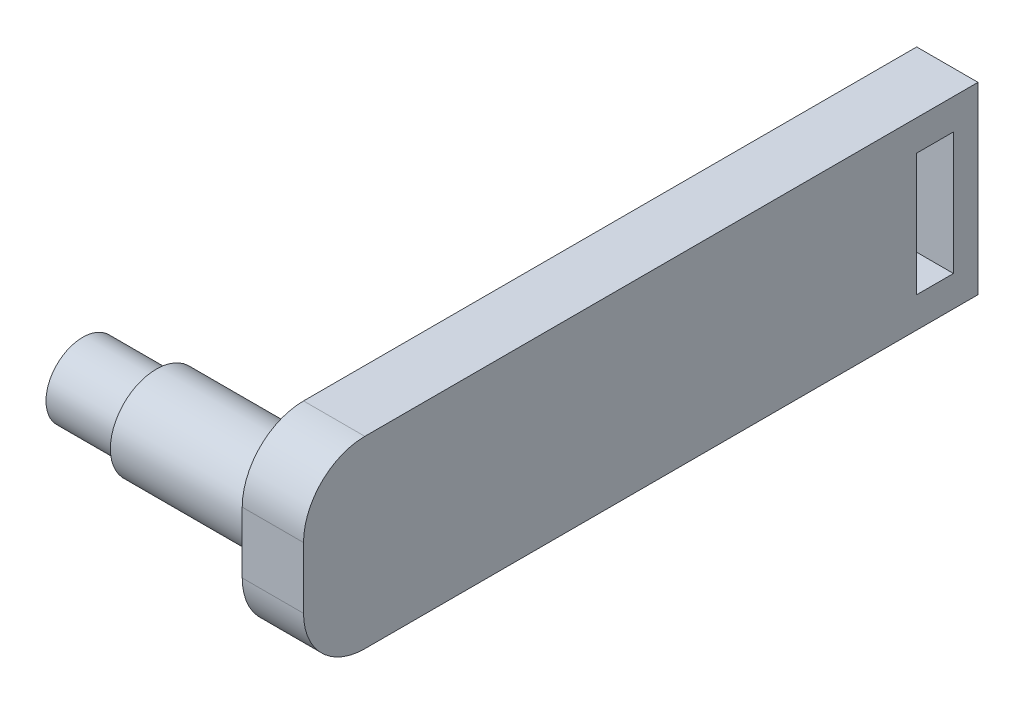
ISO-10303-21;
HEADER;
FILE_DESCRIPTION(('STEP AP214'),'2;1');
FILE_NAME('part.step','',(''),(''),'','','');
FILE_SCHEMA(('AUTOMOTIVE_DESIGN { 1 0 10303 214 1 1 1 1 }'));
ENDSEC;
DATA;
#1=APPLICATION_CONTEXT('core data for automotive mechanical design processes');
#2=APPLICATION_PROTOCOL_DEFINITION('international standard','automotive_design',2000,#1);
#3=PRODUCT_CONTEXT('',#1,'mechanical');
#4=PRODUCT('Part','Part','',(#3));
#5=PRODUCT_RELATED_PRODUCT_CATEGORY('part','',(#4));
#6=PRODUCT_DEFINITION_FORMATION('','',#4);
#7=PRODUCT_DEFINITION_CONTEXT('part definition',#1,'design');
#8=PRODUCT_DEFINITION('design','',#6,#7);
#9=PRODUCT_DEFINITION_SHAPE('','',#8);
#10=(LENGTH_UNIT() NAMED_UNIT(*) SI_UNIT(.MILLI.,.METRE.));
#11=(NAMED_UNIT(*) PLANE_ANGLE_UNIT() SI_UNIT($,.RADIAN.));
#12=(NAMED_UNIT(*) SI_UNIT($,.STERADIAN.) SOLID_ANGLE_UNIT());
#13=UNCERTAINTY_MEASURE_WITH_UNIT(LENGTH_MEASURE(1.E-05),#10,'distance_accuracy_value','');
#14=(GEOMETRIC_REPRESENTATION_CONTEXT(3) GLOBAL_UNCERTAINTY_ASSIGNED_CONTEXT((#13)) GLOBAL_UNIT_ASSIGNED_CONTEXT((#10,
#11,#12)) REPRESENTATION_CONTEXT('',''));
#15=CARTESIAN_POINT('',(0.,0.,0.));
#16=DIRECTION('',(0.,0.,1.));
#17=DIRECTION('',(1.,0.,0.));
#18=AXIS2_PLACEMENT_3D('',#15,#16,#17);
#19=CARTESIAN_POINT('',(0.,15.,26.2097315436242));
#20=DIRECTION('',(0.,0.,-1.));
#21=DIRECTION('',(-1.,0.,0.));
#22=AXIS2_PLACEMENT_3D('',#19,#20,#21);
#23=PLANE('',#22);
#24=DIRECTION('',(0.,-1.,0.));
#25=VECTOR('',#24,1.);
#26=CARTESIAN_POINT('',(-56.8805369127517,15.,26.2097315436242));
#27=LINE('',#26,#25);
#28=CARTESIAN_POINT('',(-56.8805369127517,10.,26.2097315436242));
#29=VERTEX_POINT('',#28);
#30=CARTESIAN_POINT('',(-56.8805369127517,5.,26.2097315436242));
#31=VERTEX_POINT('',#30);
#32=EDGE_CURVE('E169',#29,#31,#27,.T.);
#33=ORIENTED_EDGE('',*,*,#32,.F.);
#34=DIRECTION('',(1.,0.,0.));
#35=VECTOR('',#34,1.);
#36=CARTESIAN_POINT('',(-61.8805369127517,10.,26.2097315436242));
#37=LINE('',#36,#35);
#38=CARTESIAN_POINT('',(-61.8805369127517,10.,26.2097315436242));
#39=VERTEX_POINT('',#38);
#40=EDGE_CURVE('E182',#29,#39,#37,.F.);
#41=ORIENTED_EDGE('',*,*,#40,.T.);
#42=DIRECTION('',(0.,-1.,0.));
#43=VECTOR('',#42,1.);
#44=CARTESIAN_POINT('',(-61.8805369127517,15.,26.2097315436242));
#45=LINE('',#44,#43);
#46=CARTESIAN_POINT('',(-61.8805369127517,5.,26.2097315436242));
#47=VERTEX_POINT('',#46);
#48=EDGE_CURVE('E155',#39,#47,#45,.T.);
#49=ORIENTED_EDGE('',*,*,#48,.T.);
#50=DIRECTION('',(1.,0.,0.));
#51=VECTOR('',#50,1.);
#52=CARTESIAN_POINT('',(0.,5.,26.2097315436242));
#53=LINE('',#52,#51);
#54=EDGE_CURVE('E179',#47,#31,#53,.T.);
#55=ORIENTED_EDGE('',*,*,#54,.T.);
#56=EDGE_LOOP('',(#33,#41,#49,#55));
#57=FACE_BOUND('',#56,.T.);
#58=ADVANCED_FACE('F38',(#57),#23,.F.);
#59=CARTESIAN_POINT('',(-56.8805369127517,15.,0.));
#60=DIRECTION('',(-1.,0.,0.));
#61=DIRECTION('',(0.,0.,1.));
#62=AXIS2_PLACEMENT_3D('',#59,#60,#61);
#63=PLANE('',#62);
#64=DIRECTION('',(0.,0.,1.));
#65=VECTOR('',#64,1.);
#66=CARTESIAN_POINT('',(-56.8805369127517,12.5,-26.7902684563758));
#67=LINE('',#66,#65);
#68=CARTESIAN_POINT('',(-56.8805369127517,12.5,-26.7902684563758));
#69=VERTEX_POINT('',#68);
#70=CARTESIAN_POINT('',(-56.8805369127517,12.5,-23.7902684563758));
#71=VERTEX_POINT('',#70);
#72=EDGE_CURVE('E296',#69,#71,#67,.T.);
#73=ORIENTED_EDGE('',*,*,#72,.F.);
#74=DIRECTION('',(0.,1.,0.));
#75=VECTOR('',#74,1.);
#76=CARTESIAN_POINT('',(-56.8805369127517,2.5,-26.7902684563758));
#77=LINE('',#76,#75);
#78=CARTESIAN_POINT('',(-56.8805369127517,2.5,-26.7902684563758));
#79=VERTEX_POINT('',#78);
#80=EDGE_CURVE('E146',#79,#69,#77,.T.);
#81=ORIENTED_EDGE('',*,*,#80,.F.);
#82=DIRECTION('',(0.,0.,-1.));
#83=VECTOR('',#82,1.);
#84=CARTESIAN_POINT('',(-56.8805369127517,2.5,-26.7902684563758));
#85=LINE('',#84,#83);
#86=CARTESIAN_POINT('',(-56.8805369127517,2.5,-23.7902684563758));
#87=VERTEX_POINT('',#86);
#88=EDGE_CURVE('E143',#87,#79,#85,.T.);
#89=ORIENTED_EDGE('',*,*,#88,.F.);
#90=DIRECTION('',(0.,-1.,0.));
#91=VECTOR('',#90,1.);
#92=CARTESIAN_POINT('',(-56.8805369127517,2.5,-23.7902684563758));
#93=LINE('',#92,#91);
#94=EDGE_CURVE('E121',#71,#87,#93,.T.);
#95=ORIENTED_EDGE('',*,*,#94,.F.);
#96=EDGE_LOOP('',(#73,#81,#89,#95));
#97=FACE_BOUND('',#96,.T.);
#98=DIRECTION('',(0.,0.,-1.));
#99=VECTOR('',#98,1.);
#100=CARTESIAN_POINT('',(-56.8805369127517,15.,0.));
#101=LINE('',#100,#99);
#102=CARTESIAN_POINT('',(-56.8805369127517,15.,21.2097315436242));
#103=VERTEX_POINT('',#102);
#104=CARTESIAN_POINT('',(-56.8805369127517,15.,-28.7902684563758));
#105=VERTEX_POINT('',#104);
#106=EDGE_CURVE('E147',#103,#105,#101,.T.);
#107=ORIENTED_EDGE('',*,*,#106,.F.);
#108=CARTESIAN_POINT('',(-56.8805369127517,10.,21.2097315436242));
#109=DIRECTION('',(-1.,0.,0.));
#110=DIRECTION('',(0.,0.,1.));
#111=AXIS2_PLACEMENT_3D('',#108,#109,#110);
#112=CIRCLE('',#111,5.);
#113=EDGE_CURVE('E177',#103,#29,#112,.F.);
#114=ORIENTED_EDGE('',*,*,#113,.T.);
#115=ORIENTED_EDGE('',*,*,#32,.T.);
#116=CARTESIAN_POINT('',(-56.8805369127517,5.,21.2097315436242));
#117=DIRECTION('',(-1.,0.,0.));
#118=DIRECTION('',(0.,0.,1.));
#119=AXIS2_PLACEMENT_3D('',#116,#117,#118);
#120=CIRCLE('',#119,5.);
#121=CARTESIAN_POINT('',(-56.8805369127517,0.,21.2097315436242));
#122=VERTEX_POINT('',#121);
#123=EDGE_CURVE('E175',#31,#122,#120,.F.);
#124=ORIENTED_EDGE('',*,*,#123,.T.);
#125=DIRECTION('',(0.,0.,-1.));
#126=VECTOR('',#125,1.);
#127=CARTESIAN_POINT('',(-56.8805369127517,0.,0.));
#128=LINE('',#127,#126);
#129=CARTESIAN_POINT('',(-56.8805369127517,0.,-28.7902684563758));
#130=VERTEX_POINT('',#129);
#131=EDGE_CURVE('E145',#122,#130,#128,.T.);
#132=ORIENTED_EDGE('',*,*,#131,.T.);
#133=DIRECTION('',(0.,-1.,0.));
#134=VECTOR('',#133,1.);
#135=CARTESIAN_POINT('',(-56.8805369127517,15.,-28.7902684563758));
#136=LINE('',#135,#134);
#137=EDGE_CURVE('E166',#105,#130,#136,.T.);
#138=ORIENTED_EDGE('',*,*,#137,.F.);
#139=EDGE_LOOP('',(#107,#114,#115,#124,#132,#138));
#140=FACE_BOUND('',#139,.T.);
#141=ADVANCED_FACE('F203',(#97,#140),#63,.F.);
#142=CARTESIAN_POINT('',(0.,15.,-28.7902684563758));
#143=DIRECTION('',(0.,0.,-1.));
#144=DIRECTION('',(-1.,0.,0.));
#145=AXIS2_PLACEMENT_3D('',#142,#143,#144);
#146=PLANE('',#145);
#147=DIRECTION('',(1.,0.,0.));
#148=VECTOR('',#147,1.);
#149=CARTESIAN_POINT('',(0.,0.,-28.7902684563758));
#150=LINE('',#149,#148);
#151=CARTESIAN_POINT('',(-61.8805369127517,0.,-28.7902684563758));
#152=VERTEX_POINT('',#151);
#153=EDGE_CURVE('E157',#152,#130,#150,.T.);
#154=ORIENTED_EDGE('',*,*,#153,.F.);
#155=DIRECTION('',(0.,-1.,0.));
#156=VECTOR('',#155,1.);
#157=CARTESIAN_POINT('',(-61.8805369127517,15.,-28.7902684563758));
#158=LINE('',#157,#156);
#159=CARTESIAN_POINT('',(-61.8805369127517,15.,-28.7902684563758));
#160=VERTEX_POINT('',#159);
#161=EDGE_CURVE('E163',#160,#152,#158,.T.);
#162=ORIENTED_EDGE('',*,*,#161,.F.);
#163=DIRECTION('',(1.,0.,0.));
#164=VECTOR('',#163,1.);
#165=CARTESIAN_POINT('',(0.,15.,-28.7902684563758));
#166=LINE('',#165,#164);
#167=EDGE_CURVE('E149',#160,#105,#166,.T.);
#168=ORIENTED_EDGE('',*,*,#167,.T.);
#169=ORIENTED_EDGE('',*,*,#137,.T.);
#170=EDGE_LOOP('',(#154,#162,#168,#169));
#171=FACE_BOUND('',#170,.T.);
#172=ADVANCED_FACE('F214',(#171),#146,.T.);
#173=CARTESIAN_POINT('',(-61.8805369127517,15.,0.));
#174=DIRECTION('',(-1.,0.,0.));
#175=DIRECTION('',(0.,0.,1.));
#176=AXIS2_PLACEMENT_3D('',#173,#174,#175);
#177=PLANE('',#176);
#178=CARTESIAN_POINT('',(-61.8805369127517,7.5,21.2097315436242));
#179=DIRECTION('',(-1.,0.,0.));
#180=DIRECTION('',(0.,0.,1.));
#181=AXIS2_PLACEMENT_3D('',#178,#179,#180);
#182=CIRCLE('',#181,3.75);
#183=CARTESIAN_POINT('',(-61.8805369127517,7.5,24.9597315436242));
#184=VERTEX_POINT('',#183);
#185=EDGE_CURVE('E288',#184,#184,#182,.T.);
#186=ORIENTED_EDGE('',*,*,#185,.F.);
#187=EDGE_LOOP('',(#186));
#188=FACE_BOUND('',#187,.T.);
#189=DIRECTION('',(0.,-1.,0.));
#190=VECTOR('',#189,1.);
#191=CARTESIAN_POINT('',(-61.8805369127517,2.5,-26.7902684563758));
#192=LINE('',#191,#190);
#193=CARTESIAN_POINT('',(-61.8805369127517,12.5,-26.7902684563758));
#194=VERTEX_POINT('',#193);
#195=CARTESIAN_POINT('',(-61.8805369127517,2.5,-26.7902684563758));
#196=VERTEX_POINT('',#195);
#197=EDGE_CURVE('E61',#194,#196,#192,.T.);
#198=ORIENTED_EDGE('',*,*,#197,.F.);
#199=DIRECTION('',(0.,0.,-1.));
#200=VECTOR('',#199,1.);
#201=CARTESIAN_POINT('',(-61.8805369127517,12.5,-26.7902684563758));
#202=LINE('',#201,#200);
#203=CARTESIAN_POINT('',(-61.8805369127517,12.5,-23.7902684563758));
#204=VERTEX_POINT('',#203);
#205=EDGE_CURVE('E134',#204,#194,#202,.T.);
#206=ORIENTED_EDGE('',*,*,#205,.F.);
#207=DIRECTION('',(0.,1.,0.));
#208=VECTOR('',#207,1.);
#209=CARTESIAN_POINT('',(-61.8805369127517,2.5,-23.7902684563758));
#210=LINE('',#209,#208);
#211=CARTESIAN_POINT('',(-61.8805369127517,2.5,-23.7902684563758));
#212=VERTEX_POINT('',#211);
#213=EDGE_CURVE('E118',#212,#204,#210,.T.);
#214=ORIENTED_EDGE('',*,*,#213,.F.);
#215=DIRECTION('',(0.,0.,1.));
#216=VECTOR('',#215,1.);
#217=CARTESIAN_POINT('',(-61.8805369127517,2.5,-26.7902684563758));
#218=LINE('',#217,#216);
#219=EDGE_CURVE('E127',#196,#212,#218,.T.);
#220=ORIENTED_EDGE('',*,*,#219,.F.);
#221=EDGE_LOOP('',(#198,#206,#214,#220));
#222=FACE_BOUND('',#221,.T.);
#223=ORIENTED_EDGE('',*,*,#48,.F.);
#224=CARTESIAN_POINT('',(-61.8805369127517,10.,21.2097315436242));
#225=DIRECTION('',(-1.,0.,0.));
#226=DIRECTION('',(0.,0.,1.));
#227=AXIS2_PLACEMENT_3D('',#224,#225,#226);
#228=CIRCLE('',#227,5.);
#229=CARTESIAN_POINT('',(-61.8805369127517,15.,21.2097315436242));
#230=VERTEX_POINT('',#229);
#231=EDGE_CURVE('E186',#39,#230,#228,.T.);
#232=ORIENTED_EDGE('',*,*,#231,.T.);
#233=DIRECTION('',(0.,0.,-1.));
#234=VECTOR('',#233,1.);
#235=CARTESIAN_POINT('',(-61.8805369127517,15.,0.));
#236=LINE('',#235,#234);
#237=EDGE_CURVE('E153',#230,#160,#236,.T.);
#238=ORIENTED_EDGE('',*,*,#237,.T.);
#239=ORIENTED_EDGE('',*,*,#161,.T.);
#240=DIRECTION('',(0.,0.,-1.));
#241=VECTOR('',#240,1.);
#242=CARTESIAN_POINT('',(-61.8805369127517,0.,0.));
#243=LINE('',#242,#241);
#244=CARTESIAN_POINT('',(-61.8805369127517,0.,21.2097315436242));
#245=VERTEX_POINT('',#244);
#246=EDGE_CURVE('E150',#245,#152,#243,.T.);
#247=ORIENTED_EDGE('',*,*,#246,.F.);
#248=CARTESIAN_POINT('',(-61.8805369127517,5.,21.2097315436242));
#249=DIRECTION('',(-1.,0.,0.));
#250=DIRECTION('',(0.,0.,1.));
#251=AXIS2_PLACEMENT_3D('',#248,#249,#250);
#252=CIRCLE('',#251,5.);
#253=EDGE_CURVE('E184',#245,#47,#252,.T.);
#254=ORIENTED_EDGE('',*,*,#253,.T.);
#255=EDGE_LOOP('',(#223,#232,#238,#239,#247,#254));
#256=FACE_BOUND('',#255,.T.);
#257=ADVANCED_FACE('F131',(#188,#222,#256),#177,.T.);
#258=CARTESIAN_POINT('',(0.,15.,0.));
#259=DIRECTION('',(0.,1.,0.));
#260=DIRECTION('',(0.,0.,1.));
#261=AXIS2_PLACEMENT_3D('',#258,#259,#260);
#262=PLANE('',#261);
#263=ORIENTED_EDGE('',*,*,#237,.F.);
#264=DIRECTION('',(1.,0.,0.));
#265=VECTOR('',#264,1.);
#266=CARTESIAN_POINT('',(-56.8805369127517,15.,21.2097315436242));
#267=LINE('',#266,#265);
#268=EDGE_CURVE('E172',#230,#103,#267,.T.);
#269=ORIENTED_EDGE('',*,*,#268,.T.);
#270=ORIENTED_EDGE('',*,*,#106,.T.);
#271=ORIENTED_EDGE('',*,*,#167,.F.);
#272=EDGE_LOOP('',(#263,#269,#270,#271));
#273=FACE_BOUND('',#272,.T.);
#274=ADVANCED_FACE('F211',(#273),#262,.T.);
#275=CARTESIAN_POINT('',(0.,0.,0.));
#276=DIRECTION('',(0.,1.,0.));
#277=DIRECTION('',(0.,0.,1.));
#278=AXIS2_PLACEMENT_3D('',#275,#276,#277);
#279=PLANE('',#278);
#280=ORIENTED_EDGE('',*,*,#131,.F.);
#281=DIRECTION('',(1.,0.,0.));
#282=VECTOR('',#281,1.);
#283=CARTESIAN_POINT('',(0.,0.,21.2097315436242));
#284=LINE('',#283,#282);
#285=EDGE_CURVE('E46',#122,#245,#284,.F.);
#286=ORIENTED_EDGE('',*,*,#285,.T.);
#287=ORIENTED_EDGE('',*,*,#246,.T.);
#288=ORIENTED_EDGE('',*,*,#153,.T.);
#289=EDGE_LOOP('',(#280,#286,#287,#288));
#290=FACE_BOUND('',#289,.T.);
#291=ADVANCED_FACE('F191',(#290),#279,.F.);
#292=CARTESIAN_POINT('',(0.,10.,21.2097315436242));
#293=DIRECTION('',(-1.,0.,0.));
#294=DIRECTION('',(0.,0.,1.));
#295=AXIS2_PLACEMENT_3D('',#292,#293,#294);
#296=CYLINDRICAL_SURFACE('',#295,5.);
#297=ORIENTED_EDGE('',*,*,#231,.F.);
#298=ORIENTED_EDGE('',*,*,#40,.F.);
#299=ORIENTED_EDGE('',*,*,#113,.F.);
#300=ORIENTED_EDGE('',*,*,#268,.F.);
#301=EDGE_LOOP('',(#297,#298,#299,#300));
#302=FACE_BOUND('',#301,.T.);
#303=ADVANCED_FACE('F208',(#302),#296,.T.);
#304=CARTESIAN_POINT('',(0.,5.,21.2097315436242));
#305=DIRECTION('',(1.,0.,0.));
#306=DIRECTION('',(0.,0.,-1.));
#307=AXIS2_PLACEMENT_3D('',#304,#305,#306);
#308=CYLINDRICAL_SURFACE('',#307,5.);
#309=ORIENTED_EDGE('',*,*,#253,.F.);
#310=ORIENTED_EDGE('',*,*,#285,.F.);
#311=ORIENTED_EDGE('',*,*,#123,.F.);
#312=ORIENTED_EDGE('',*,*,#54,.F.);
#313=EDGE_LOOP('',(#309,#310,#311,#312));
#314=FACE_BOUND('',#313,.T.);
#315=ADVANCED_FACE('F40',(#314),#308,.T.);
#316=CARTESIAN_POINT('',(-46.4402304038411,2.5,-26.7902684563758));
#317=DIRECTION('',(0.,0.,-1.));
#318=DIRECTION('',(-1.,0.,0.));
#319=AXIS2_PLACEMENT_3D('',#316,#317,#318);
#320=PLANE('',#319);
#321=ORIENTED_EDGE('',*,*,#80,.T.);
#322=DIRECTION('',(-1.,0.,0.));
#323=VECTOR('',#322,1.);
#324=CARTESIAN_POINT('',(-46.4402304038411,12.5,-26.7902684563758));
#325=LINE('',#324,#323);
#326=EDGE_CURVE('E139',#69,#194,#325,.T.);
#327=ORIENTED_EDGE('',*,*,#326,.T.);
#328=ORIENTED_EDGE('',*,*,#197,.T.);
#329=DIRECTION('',(-1.,0.,0.));
#330=VECTOR('',#329,1.);
#331=CARTESIAN_POINT('',(-46.4402304038411,2.5,-26.7902684563758));
#332=LINE('',#331,#330);
#333=EDGE_CURVE('E124',#79,#196,#332,.T.);
#334=ORIENTED_EDGE('',*,*,#333,.F.);
#335=EDGE_LOOP('',(#321,#327,#328,#334));
#336=FACE_BOUND('',#335,.T.);
#337=ADVANCED_FACE('F234',(#336),#320,.F.);
#338=CARTESIAN_POINT('',(-46.4402304038411,12.5,-26.7902684563758));
#339=DIRECTION('',(0.,1.,0.));
#340=DIRECTION('',(0.,0.,1.));
#341=AXIS2_PLACEMENT_3D('',#338,#339,#340);
#342=PLANE('',#341);
#343=ORIENTED_EDGE('',*,*,#72,.T.);
#344=DIRECTION('',(-1.,0.,0.));
#345=VECTOR('',#344,1.);
#346=CARTESIAN_POINT('',(-46.4402304038411,12.5,-23.7902684563758));
#347=LINE('',#346,#345);
#348=EDGE_CURVE('E123',#71,#204,#347,.T.);
#349=ORIENTED_EDGE('',*,*,#348,.T.);
#350=ORIENTED_EDGE('',*,*,#205,.T.);
#351=ORIENTED_EDGE('',*,*,#326,.F.);
#352=EDGE_LOOP('',(#343,#349,#350,#351));
#353=FACE_BOUND('',#352,.T.);
#354=ADVANCED_FACE('F243',(#353),#342,.F.);
#355=CARTESIAN_POINT('',(-46.4402304038411,2.5,-23.7902684563758));
#356=DIRECTION('',(0.,0.,1.));
#357=DIRECTION('',(1.,0.,0.));
#358=AXIS2_PLACEMENT_3D('',#355,#356,#357);
#359=PLANE('',#358);
#360=ORIENTED_EDGE('',*,*,#94,.T.);
#361=DIRECTION('',(-1.,0.,0.));
#362=VECTOR('',#361,1.);
#363=CARTESIAN_POINT('',(-46.4402304038411,2.5,-23.7902684563758));
#364=LINE('',#363,#362);
#365=EDGE_CURVE('E53',#87,#212,#364,.T.);
#366=ORIENTED_EDGE('',*,*,#365,.T.);
#367=ORIENTED_EDGE('',*,*,#213,.T.);
#368=ORIENTED_EDGE('',*,*,#348,.F.);
#369=EDGE_LOOP('',(#360,#366,#367,#368));
#370=FACE_BOUND('',#369,.T.);
#371=ADVANCED_FACE('F115',(#370),#359,.F.);
#372=CARTESIAN_POINT('',(-46.4402304038411,2.5,-26.7902684563758));
#373=DIRECTION('',(0.,-1.,0.));
#374=DIRECTION('',(0.,0.,-1.));
#375=AXIS2_PLACEMENT_3D('',#372,#373,#374);
#376=PLANE('',#375);
#377=ORIENTED_EDGE('',*,*,#88,.T.);
#378=ORIENTED_EDGE('',*,*,#333,.T.);
#379=ORIENTED_EDGE('',*,*,#219,.T.);
#380=ORIENTED_EDGE('',*,*,#365,.F.);
#381=EDGE_LOOP('',(#377,#378,#379,#380));
#382=FACE_BOUND('',#381,.T.);
#383=ADVANCED_FACE('F128',(#382),#376,.F.);
#384=CARTESIAN_POINT('',(-73.8805369127517,7.5,21.2097315436242));
#385=DIRECTION('',(1.,0.,0.));
#386=DIRECTION('',(0.,0.,-1.));
#387=AXIS2_PLACEMENT_3D('',#384,#385,#386);
#388=CYLINDRICAL_SURFACE('',#387,3.75);
#389=CARTESIAN_POINT('',(-73.8805369127517,7.5,21.2097315436242));
#390=DIRECTION('',(-1.,0.,0.));
#391=DIRECTION('',(0.,0.,1.));
#392=AXIS2_PLACEMENT_3D('',#389,#390,#391);
#393=CIRCLE('',#392,3.75);
#394=CARTESIAN_POINT('',(-73.8805369127517,7.5,24.9597315436242));
#395=VERTEX_POINT('',#394);
#396=EDGE_CURVE('E290',#395,#395,#393,.T.);
#397=ORIENTED_EDGE('',*,*,#396,.F.);
#398=EDGE_LOOP('',(#397));
#399=FACE_BOUND('',#398,.T.);
#400=ORIENTED_EDGE('',*,*,#185,.T.);
#401=EDGE_LOOP('',(#400));
#402=FACE_BOUND('',#401,.T.);
#403=ADVANCED_FACE('F246',(#399,#402),#388,.T.);
#404=CARTESIAN_POINT('',(-73.8805369127517,7.5,21.2097315436242));
#405=DIRECTION('',(-1.,0.,0.));
#406=DIRECTION('',(0.,0.,1.));
#407=AXIS2_PLACEMENT_3D('',#404,#405,#406);
#408=PLANE('',#407);
#409=CARTESIAN_POINT('',(-73.8805369127517,7.5,21.2097315436242));
#410=DIRECTION('',(-1.,0.,0.));
#411=DIRECTION('',(0.,0.,1.));
#412=AXIS2_PLACEMENT_3D('',#409,#410,#411);
#413=CIRCLE('',#412,3.);
#414=CARTESIAN_POINT('',(-73.8805369127517,7.5,24.2097315436242));
#415=VERTEX_POINT('',#414);
#416=EDGE_CURVE('E281',#415,#415,#413,.T.);
#417=ORIENTED_EDGE('',*,*,#416,.F.);
#418=EDGE_LOOP('',(#417));
#419=FACE_BOUND('',#418,.T.);
#420=ORIENTED_EDGE('',*,*,#396,.T.);
#421=EDGE_LOOP('',(#420));
#422=FACE_BOUND('',#421,.T.);
#423=ADVANCED_FACE('F254',(#419,#422),#408,.T.);
#424=CARTESIAN_POINT('',(-79.8805369127517,7.5,21.2097315436242));
#425=DIRECTION('',(-1.,0.,0.));
#426=DIRECTION('',(0.,0.,1.));
#427=AXIS2_PLACEMENT_3D('',#424,#425,#426);
#428=PLANE('',#427);
#429=CARTESIAN_POINT('',(-79.8805369127517,7.5,21.2097315436242));
#430=DIRECTION('',(-1.,0.,0.));
#431=DIRECTION('',(0.,0.,1.));
#432=AXIS2_PLACEMENT_3D('',#429,#430,#431);
#433=CIRCLE('',#432,3.);
#434=CARTESIAN_POINT('',(-79.8805369127517,7.5,24.2097315436242));
#435=VERTEX_POINT('',#434);
#436=EDGE_CURVE('E284',#435,#435,#433,.T.);
#437=ORIENTED_EDGE('',*,*,#436,.T.);
#438=EDGE_LOOP('',(#437));
#439=FACE_BOUND('',#438,.T.);
#440=CARTESIAN_POINT('',(-79.8805369127517,7.5,21.2097315436242));
#441=DIRECTION('',(-1.,0.,0.));
#442=DIRECTION('',(0.,0.,1.));
#443=AXIS2_PLACEMENT_3D('',#440,#441,#442);
#444=CIRCLE('',#443,1.75);
#445=CARTESIAN_POINT('',(-79.8805369127517,7.5,22.9597315436242));
#446=VERTEX_POINT('',#445);
#447=EDGE_CURVE('E278',#446,#446,#444,.T.);
#448=ORIENTED_EDGE('',*,*,#447,.F.);
#449=EDGE_LOOP('',(#448));
#450=FACE_BOUND('',#449,.T.);
#451=ADVANCED_FACE('F258',(#439,#450),#428,.T.);
#452=CARTESIAN_POINT('',(-79.8805369127517,7.5,21.2097315436242));
#453=DIRECTION('',(1.,0.,0.));
#454=DIRECTION('',(0.,0.,-1.));
#455=AXIS2_PLACEMENT_3D('',#452,#453,#454);
#456=CYLINDRICAL_SURFACE('',#455,3.);
#457=ORIENTED_EDGE('',*,*,#436,.F.);
#458=EDGE_LOOP('',(#457));
#459=FACE_BOUND('',#458,.T.);
#460=ORIENTED_EDGE('',*,*,#416,.T.);
#461=EDGE_LOOP('',(#460));
#462=FACE_BOUND('',#461,.T.);
#463=ADVANCED_FACE('F261',(#459,#462),#456,.T.);
#464=CARTESIAN_POINT('',(-79.8805369127517,7.5,21.2097315436242));
#465=DIRECTION('',(1.,0.,0.));
#466=DIRECTION('',(0.,0.,-1.));
#467=AXIS2_PLACEMENT_3D('',#464,#465,#466);
#468=CYLINDRICAL_SURFACE('',#467,1.75);
#469=ORIENTED_EDGE('',*,*,#447,.T.);
#470=EDGE_LOOP('',(#469));
#471=FACE_BOUND('',#470,.T.);
#472=CARTESIAN_POINT('',(-73.8805369127517,7.5,21.2097315436242));
#473=DIRECTION('',(-1.,0.,0.));
#474=DIRECTION('',(0.,0.,1.));
#475=AXIS2_PLACEMENT_3D('',#472,#473,#474);
#476=CIRCLE('',#475,1.75);
#477=CARTESIAN_POINT('',(-73.8805369127517,7.5,22.9597315436242));
#478=VERTEX_POINT('',#477);
#479=EDGE_CURVE('E11',#478,#478,#476,.F.);
#480=ORIENTED_EDGE('',*,*,#479,.T.);
#481=EDGE_LOOP('',(#480));
#482=FACE_BOUND('',#481,.T.);
#483=ADVANCED_FACE('F264',(#471,#482),#468,.F.);
#484=ORIENTED_EDGE('',*,*,#479,.F.);
#485=EDGE_LOOP('',(#484));
#486=FACE_BOUND('',#485,.T.);
#487=ADVANCED_FACE('F260',(#486),#408,.T.);
#488=CLOSED_SHELL('',(#58,#141,#172,#257,#274,#291,#303,#315,#337,#354,#371,#383,#403,#423,#451,
#463,#483,#487));
#489=MANIFOLD_SOLID_BREP('B2',#488);
#490=ADVANCED_BREP_SHAPE_REPRESENTATION('',(#18,#489),#14);
#491=SHAPE_DEFINITION_REPRESENTATION(#9,#490);
ENDSEC;
END-ISO-10303-21;
